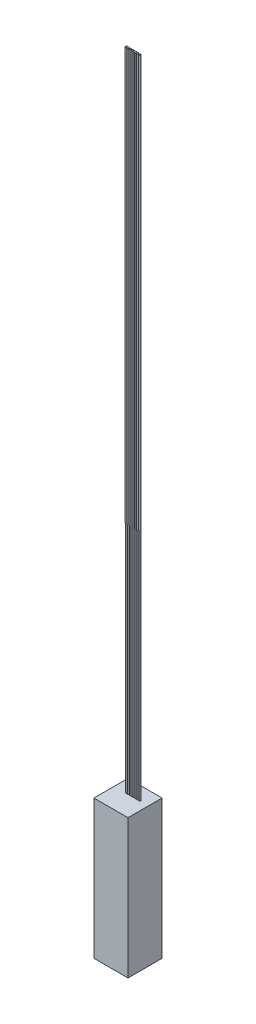
ISO-10303-21;
HEADER;
FILE_DESCRIPTION(('STEP AP214'),'2;1');
FILE_NAME('part.step','',(''),(''),'','','');
FILE_SCHEMA(('AUTOMOTIVE_DESIGN { 1 0 10303 214 1 1 1 1 }'));
ENDSEC;
DATA;
#1=APPLICATION_CONTEXT('core data for automotive mechanical design processes');
#2=APPLICATION_PROTOCOL_DEFINITION('international standard','automotive_design',2000,#1);
#3=PRODUCT_CONTEXT('',#1,'mechanical');
#4=PRODUCT('Part','Part','',(#3));
#5=PRODUCT_RELATED_PRODUCT_CATEGORY('part','',(#4));
#6=PRODUCT_DEFINITION_FORMATION('','',#4);
#7=PRODUCT_DEFINITION_CONTEXT('part definition',#1,'design');
#8=PRODUCT_DEFINITION('design','',#6,#7);
#9=PRODUCT_DEFINITION_SHAPE('','',#8);
#10=(LENGTH_UNIT() NAMED_UNIT(*) SI_UNIT(.MILLI.,.METRE.));
#11=(NAMED_UNIT(*) PLANE_ANGLE_UNIT() SI_UNIT($,.RADIAN.));
#12=(NAMED_UNIT(*) SI_UNIT($,.STERADIAN.) SOLID_ANGLE_UNIT());
#13=UNCERTAINTY_MEASURE_WITH_UNIT(LENGTH_MEASURE(1.E-05),#10,'distance_accuracy_value','');
#14=(GEOMETRIC_REPRESENTATION_CONTEXT(3) GLOBAL_UNCERTAINTY_ASSIGNED_CONTEXT((#13)) GLOBAL_UNIT_ASSIGNED_CONTEXT((#10,
#11,#12)) REPRESENTATION_CONTEXT('',''));
#15=CARTESIAN_POINT('',(0.,0.,0.));
#16=DIRECTION('',(0.,0.,1.));
#17=DIRECTION('',(1.,0.,0.));
#18=AXIS2_PLACEMENT_3D('',#15,#16,#17);
#19=CARTESIAN_POINT('',(1.13,57.1,0.968));
#20=DIRECTION('',(0.,-1.,0.));
#21=DIRECTION('',(0.,0.,-1.));
#22=AXIS2_PLACEMENT_3D('',#19,#20,#21);
#23=CYLINDRICAL_SURFACE('',#22,0.0649999999999999);
#24=CARTESIAN_POINT('',(1.13,57.1,0.968));
#25=DIRECTION('',(0.,1.,0.));
#26=DIRECTION('',(0.,0.,1.));
#27=AXIS2_PLACEMENT_3D('',#24,#25,#26);
#28=CIRCLE('',#27,0.0649999999999999);
#29=CARTESIAN_POINT('',(1.13,57.1,1.033));
#30=VERTEX_POINT('',#29);
#31=EDGE_CURVE('E11',#30,#30,#28,.T.);
#32=ORIENTED_EDGE('',*,*,#31,.F.);
#33=EDGE_LOOP('',(#32));
#34=FACE_BOUND('',#33,.T.);
#35=CARTESIAN_POINT('',(1.13,27.1,0.968));
#36=DIRECTION('',(0.,1.,0.));
#37=DIRECTION('',(0.,0.,1.));
#38=AXIS2_PLACEMENT_3D('',#35,#36,#37);
#39=CIRCLE('',#38,0.0649999999999999);
#40=CARTESIAN_POINT('',(1.13,27.1,1.033));
#41=VERTEX_POINT('',#40);
#42=EDGE_CURVE('E42',#41,#41,#39,.T.);
#43=ORIENTED_EDGE('',*,*,#42,.T.);
#44=EDGE_LOOP('',(#43));
#45=FACE_BOUND('',#44,.T.);
#46=ADVANCED_FACE('F39',(#34,#45),#23,.T.);
#47=CARTESIAN_POINT('',(1.13,57.1,0.968));
#48=DIRECTION('',(0.,1.,0.));
#49=DIRECTION('',(0.,0.,1.));
#50=AXIS2_PLACEMENT_3D('',#47,#48,#49);
#51=PLANE('',#50);
#52=ORIENTED_EDGE('',*,*,#31,.T.);
#53=EDGE_LOOP('',(#52));
#54=FACE_BOUND('',#53,.T.);
#55=ADVANCED_FACE('F54',(#54),#51,.T.);
#56=CARTESIAN_POINT('',(1.13,27.1,0.968));
#57=DIRECTION('',(0.,1.,0.));
#58=DIRECTION('',(0.,0.,1.));
#59=AXIS2_PLACEMENT_3D('',#56,#57,#58);
#60=PLANE('',#59);
#61=ORIENTED_EDGE('',*,*,#42,.F.);
#62=EDGE_LOOP('',(#61));
#63=FACE_BOUND('',#62,.T.);
#64=ADVANCED_FACE('F52',(#63),#60,.F.);
#65=CLOSED_SHELL('',(#46,#55,#64));
#66=MANIFOLD_SOLID_BREP('B2',#65);
#67=CARTESIAN_POINT('',(0.99,57.1,0.968));
#68=DIRECTION('',(0.,-1.,0.));
#69=DIRECTION('',(0.,0.,-1.));
#70=AXIS2_PLACEMENT_3D('',#67,#68,#69);
#71=CYLINDRICAL_SURFACE('',#70,0.0649999999999999);
#72=CARTESIAN_POINT('',(0.99,57.1,0.968));
#73=DIRECTION('',(0.,1.,0.));
#74=DIRECTION('',(0.,0.,1.));
#75=AXIS2_PLACEMENT_3D('',#72,#73,#74);
#76=CIRCLE('',#75,0.0649999999999999);
#77=CARTESIAN_POINT('',(0.99,57.1,1.033));
#78=VERTEX_POINT('',#77);
#79=EDGE_CURVE('E38',#78,#78,#76,.T.);
#80=ORIENTED_EDGE('',*,*,#79,.F.);
#81=EDGE_LOOP('',(#80));
#82=FACE_BOUND('',#81,.T.);
#83=CARTESIAN_POINT('',(0.99,27.1,0.968));
#84=DIRECTION('',(0.,1.,0.));
#85=DIRECTION('',(0.,0.,1.));
#86=AXIS2_PLACEMENT_3D('',#83,#84,#85);
#87=CIRCLE('',#86,0.0649999999999999);
#88=CARTESIAN_POINT('',(0.99,27.1,1.033));
#89=VERTEX_POINT('',#88);
#90=EDGE_CURVE('E90',#89,#89,#87,.T.);
#91=ORIENTED_EDGE('',*,*,#90,.T.);
#92=EDGE_LOOP('',(#91));
#93=FACE_BOUND('',#92,.T.);
#94=ADVANCED_FACE('F87',(#82,#93),#71,.T.);
#95=CARTESIAN_POINT('',(0.99,57.1,0.968));
#96=DIRECTION('',(0.,1.,0.));
#97=DIRECTION('',(0.,0.,1.));
#98=AXIS2_PLACEMENT_3D('',#95,#96,#97);
#99=PLANE('',#98);
#100=ORIENTED_EDGE('',*,*,#79,.T.);
#101=EDGE_LOOP('',(#100));
#102=FACE_BOUND('',#101,.T.);
#103=ADVANCED_FACE('F102',(#102),#99,.T.);
#104=CARTESIAN_POINT('',(0.99,27.1,0.968));
#105=DIRECTION('',(0.,1.,0.));
#106=DIRECTION('',(0.,0.,1.));
#107=AXIS2_PLACEMENT_3D('',#104,#105,#106);
#108=PLANE('',#107);
#109=ORIENTED_EDGE('',*,*,#90,.F.);
#110=EDGE_LOOP('',(#109));
#111=FACE_BOUND('',#110,.T.);
#112=ADVANCED_FACE('F100',(#111),#108,.F.);
#113=CLOSED_SHELL('',(#94,#103,#112));
#114=MANIFOLD_SOLID_BREP('B6',#113);
#115=CARTESIAN_POINT('',(0.85,57.1,0.968));
#116=DIRECTION('',(0.,-1.,0.));
#117=DIRECTION('',(0.,0.,-1.));
#118=AXIS2_PLACEMENT_3D('',#115,#116,#117);
#119=CYLINDRICAL_SURFACE('',#118,0.065);
#120=CARTESIAN_POINT('',(0.85,57.1,0.968));
#121=DIRECTION('',(0.,1.,0.));
#122=DIRECTION('',(0.,0.,1.));
#123=AXIS2_PLACEMENT_3D('',#120,#121,#122);
#124=CIRCLE('',#123,0.065);
#125=CARTESIAN_POINT('',(0.85,57.1,1.033));
#126=VERTEX_POINT('',#125);
#127=EDGE_CURVE('E86',#126,#126,#124,.T.);
#128=ORIENTED_EDGE('',*,*,#127,.F.);
#129=EDGE_LOOP('',(#128));
#130=FACE_BOUND('',#129,.T.);
#131=CARTESIAN_POINT('',(0.85,27.1,0.968));
#132=DIRECTION('',(0.,1.,0.));
#133=DIRECTION('',(0.,0.,1.));
#134=AXIS2_PLACEMENT_3D('',#131,#132,#133);
#135=CIRCLE('',#134,0.065);
#136=CARTESIAN_POINT('',(0.85,27.1,1.033));
#137=VERTEX_POINT('',#136);
#138=EDGE_CURVE('E138',#137,#137,#135,.T.);
#139=ORIENTED_EDGE('',*,*,#138,.T.);
#140=EDGE_LOOP('',(#139));
#141=FACE_BOUND('',#140,.T.);
#142=ADVANCED_FACE('F135',(#130,#141),#119,.T.);
#143=CARTESIAN_POINT('',(0.85,57.1,0.968));
#144=DIRECTION('',(0.,1.,0.));
#145=DIRECTION('',(0.,0.,1.));
#146=AXIS2_PLACEMENT_3D('',#143,#144,#145);
#147=PLANE('',#146);
#148=ORIENTED_EDGE('',*,*,#127,.T.);
#149=EDGE_LOOP('',(#148));
#150=FACE_BOUND('',#149,.T.);
#151=ADVANCED_FACE('F150',(#150),#147,.T.);
#152=CARTESIAN_POINT('',(0.85,27.1,0.968));
#153=DIRECTION('',(0.,1.,0.));
#154=DIRECTION('',(0.,0.,1.));
#155=AXIS2_PLACEMENT_3D('',#152,#153,#154);
#156=PLANE('',#155);
#157=ORIENTED_EDGE('',*,*,#138,.F.);
#158=EDGE_LOOP('',(#157));
#159=FACE_BOUND('',#158,.T.);
#160=ADVANCED_FACE('F148',(#159),#156,.F.);
#161=CLOSED_SHELL('',(#142,#151,#160));
#162=MANIFOLD_SOLID_BREP('B33',#161);
#163=CARTESIAN_POINT('',(1.27,57.1,0.968));
#164=DIRECTION('',(0.,-1.,0.));
#165=DIRECTION('',(0.,0.,-1.));
#166=AXIS2_PLACEMENT_3D('',#163,#164,#165);
#167=CYLINDRICAL_SURFACE('',#166,0.0650000000000001);
#168=CARTESIAN_POINT('',(1.27,57.1,0.968));
#169=DIRECTION('',(0.,1.,0.));
#170=DIRECTION('',(0.,0.,1.));
#171=AXIS2_PLACEMENT_3D('',#168,#169,#170);
#172=CIRCLE('',#171,0.0650000000000001);
#173=CARTESIAN_POINT('',(1.27,57.1,1.033));
#174=VERTEX_POINT('',#173);
#175=EDGE_CURVE('E134',#174,#174,#172,.T.);
#176=ORIENTED_EDGE('',*,*,#175,.F.);
#177=EDGE_LOOP('',(#176));
#178=FACE_BOUND('',#177,.T.);
#179=CARTESIAN_POINT('',(1.27,27.1,0.968));
#180=DIRECTION('',(0.,1.,0.));
#181=DIRECTION('',(0.,0.,1.));
#182=AXIS2_PLACEMENT_3D('',#179,#180,#181);
#183=CIRCLE('',#182,0.0650000000000001);
#184=CARTESIAN_POINT('',(1.27,27.1,1.033));
#185=VERTEX_POINT('',#184);
#186=EDGE_CURVE('E186',#185,#185,#183,.T.);
#187=ORIENTED_EDGE('',*,*,#186,.T.);
#188=EDGE_LOOP('',(#187));
#189=FACE_BOUND('',#188,.T.);
#190=ADVANCED_FACE('F183',(#178,#189),#167,.T.);
#191=CARTESIAN_POINT('',(1.27,57.1,0.968));
#192=DIRECTION('',(0.,1.,0.));
#193=DIRECTION('',(0.,0.,1.));
#194=AXIS2_PLACEMENT_3D('',#191,#192,#193);
#195=PLANE('',#194);
#196=ORIENTED_EDGE('',*,*,#175,.T.);
#197=EDGE_LOOP('',(#196));
#198=FACE_BOUND('',#197,.T.);
#199=ADVANCED_FACE('F198',(#198),#195,.T.);
#200=CARTESIAN_POINT('',(1.27,27.1,0.968));
#201=DIRECTION('',(0.,1.,0.));
#202=DIRECTION('',(0.,0.,1.));
#203=AXIS2_PLACEMENT_3D('',#200,#201,#202);
#204=PLANE('',#203);
#205=ORIENTED_EDGE('',*,*,#186,.F.);
#206=EDGE_LOOP('',(#205));
#207=FACE_BOUND('',#206,.T.);
#208=ADVANCED_FACE('F196',(#207),#204,.F.);
#209=CLOSED_SHELL('',(#190,#199,#208));
#210=MANIFOLD_SOLID_BREP('B81',#209);
#211=CARTESIAN_POINT('',(1.41,57.1,0.968));
#212=DIRECTION('',(0.,-1.,0.));
#213=DIRECTION('',(0.,0.,-1.));
#214=AXIS2_PLACEMENT_3D('',#211,#212,#213);
#215=CYLINDRICAL_SURFACE('',#214,0.0650000000000001);
#216=CARTESIAN_POINT('',(1.41,57.1,0.968));
#217=DIRECTION('',(0.,1.,0.));
#218=DIRECTION('',(0.,0.,1.));
#219=AXIS2_PLACEMENT_3D('',#216,#217,#218);
#220=CIRCLE('',#219,0.0650000000000001);
#221=CARTESIAN_POINT('',(1.41,57.1,1.033));
#222=VERTEX_POINT('',#221);
#223=EDGE_CURVE('E182',#222,#222,#220,.T.);
#224=ORIENTED_EDGE('',*,*,#223,.F.);
#225=EDGE_LOOP('',(#224));
#226=FACE_BOUND('',#225,.T.);
#227=CARTESIAN_POINT('',(1.41,27.1,0.968));
#228=DIRECTION('',(0.,1.,0.));
#229=DIRECTION('',(0.,0.,1.));
#230=AXIS2_PLACEMENT_3D('',#227,#228,#229);
#231=CIRCLE('',#230,0.0650000000000001);
#232=CARTESIAN_POINT('',(1.41,27.1,1.033));
#233=VERTEX_POINT('',#232);
#234=EDGE_CURVE('E234',#233,#233,#231,.T.);
#235=ORIENTED_EDGE('',*,*,#234,.T.);
#236=EDGE_LOOP('',(#235));
#237=FACE_BOUND('',#236,.T.);
#238=ADVANCED_FACE('F231',(#226,#237),#215,.T.);
#239=CARTESIAN_POINT('',(1.41,57.1,0.968));
#240=DIRECTION('',(0.,1.,0.));
#241=DIRECTION('',(0.,0.,1.));
#242=AXIS2_PLACEMENT_3D('',#239,#240,#241);
#243=PLANE('',#242);
#244=ORIENTED_EDGE('',*,*,#223,.T.);
#245=EDGE_LOOP('',(#244));
#246=FACE_BOUND('',#245,.T.);
#247=ADVANCED_FACE('F246',(#246),#243,.T.);
#248=CARTESIAN_POINT('',(1.41,27.1,0.968));
#249=DIRECTION('',(0.,1.,0.));
#250=DIRECTION('',(0.,0.,1.));
#251=AXIS2_PLACEMENT_3D('',#248,#249,#250);
#252=PLANE('',#251);
#253=ORIENTED_EDGE('',*,*,#234,.F.);
#254=EDGE_LOOP('',(#253));
#255=FACE_BOUND('',#254,.T.);
#256=ADVANCED_FACE('F244',(#255),#252,.F.);
#257=CLOSED_SHELL('',(#238,#247,#256));
#258=MANIFOLD_SOLID_BREP('B129',#257);
#259=CARTESIAN_POINT('',(1.55,57.1,0.968));
#260=DIRECTION('',(0.,-1.,0.));
#261=DIRECTION('',(0.,0.,-1.));
#262=AXIS2_PLACEMENT_3D('',#259,#260,#261);
#263=CYLINDRICAL_SURFACE('',#262,0.0649999999999999);
#264=CARTESIAN_POINT('',(1.55,57.1,0.968));
#265=DIRECTION('',(0.,1.,0.));
#266=DIRECTION('',(0.,0.,1.));
#267=AXIS2_PLACEMENT_3D('',#264,#265,#266);
#268=CIRCLE('',#267,0.0649999999999999);
#269=CARTESIAN_POINT('',(1.55,57.1,1.033));
#270=VERTEX_POINT('',#269);
#271=EDGE_CURVE('E230',#270,#270,#268,.T.);
#272=ORIENTED_EDGE('',*,*,#271,.F.);
#273=EDGE_LOOP('',(#272));
#274=FACE_BOUND('',#273,.T.);
#275=CARTESIAN_POINT('',(1.55,27.1,0.968));
#276=DIRECTION('',(0.,1.,0.));
#277=DIRECTION('',(0.,0.,1.));
#278=AXIS2_PLACEMENT_3D('',#275,#276,#277);
#279=CIRCLE('',#278,0.0649999999999999);
#280=CARTESIAN_POINT('',(1.55,27.1,1.033));
#281=VERTEX_POINT('',#280);
#282=EDGE_CURVE('E282',#281,#281,#279,.T.);
#283=ORIENTED_EDGE('',*,*,#282,.T.);
#284=EDGE_LOOP('',(#283));
#285=FACE_BOUND('',#284,.T.);
#286=ADVANCED_FACE('F279',(#274,#285),#263,.T.);
#287=CARTESIAN_POINT('',(1.55,57.1,0.968));
#288=DIRECTION('',(0.,1.,0.));
#289=DIRECTION('',(0.,0.,1.));
#290=AXIS2_PLACEMENT_3D('',#287,#288,#289);
#291=PLANE('',#290);
#292=ORIENTED_EDGE('',*,*,#271,.T.);
#293=EDGE_LOOP('',(#292));
#294=FACE_BOUND('',#293,.T.);
#295=ADVANCED_FACE('F294',(#294),#291,.T.);
#296=CARTESIAN_POINT('',(1.55,27.1,0.968));
#297=DIRECTION('',(0.,1.,0.));
#298=DIRECTION('',(0.,0.,1.));
#299=AXIS2_PLACEMENT_3D('',#296,#297,#298);
#300=PLANE('',#299);
#301=ORIENTED_EDGE('',*,*,#282,.F.);
#302=EDGE_LOOP('',(#301));
#303=FACE_BOUND('',#302,.T.);
#304=ADVANCED_FACE('F292',(#303),#300,.F.);
#305=CLOSED_SHELL('',(#286,#295,#304));
#306=MANIFOLD_SOLID_BREP('B177',#305);
#307=CARTESIAN_POINT('',(1.69,57.1,0.968));
#308=DIRECTION('',(0.,-1.,0.));
#309=DIRECTION('',(0.,0.,-1.));
#310=AXIS2_PLACEMENT_3D('',#307,#308,#309);
#311=CYLINDRICAL_SURFACE('',#310,0.0649999999999999);
#312=CARTESIAN_POINT('',(1.69,57.1,0.968));
#313=DIRECTION('',(0.,1.,0.));
#314=DIRECTION('',(0.,0.,1.));
#315=AXIS2_PLACEMENT_3D('',#312,#313,#314);
#316=CIRCLE('',#315,0.0649999999999999);
#317=CARTESIAN_POINT('',(1.69,57.1,1.033));
#318=VERTEX_POINT('',#317);
#319=EDGE_CURVE('E278',#318,#318,#316,.T.);
#320=ORIENTED_EDGE('',*,*,#319,.F.);
#321=EDGE_LOOP('',(#320));
#322=FACE_BOUND('',#321,.T.);
#323=CARTESIAN_POINT('',(1.69,27.1,0.968));
#324=DIRECTION('',(0.,1.,0.));
#325=DIRECTION('',(0.,0.,1.));
#326=AXIS2_PLACEMENT_3D('',#323,#324,#325);
#327=CIRCLE('',#326,0.0649999999999999);
#328=CARTESIAN_POINT('',(1.69,27.1,1.033));
#329=VERTEX_POINT('',#328);
#330=EDGE_CURVE('E330',#329,#329,#327,.T.);
#331=ORIENTED_EDGE('',*,*,#330,.T.);
#332=EDGE_LOOP('',(#331));
#333=FACE_BOUND('',#332,.T.);
#334=ADVANCED_FACE('F327',(#322,#333),#311,.T.);
#335=CARTESIAN_POINT('',(1.69,57.1,0.968));
#336=DIRECTION('',(0.,1.,0.));
#337=DIRECTION('',(0.,0.,1.));
#338=AXIS2_PLACEMENT_3D('',#335,#336,#337);
#339=PLANE('',#338);
#340=ORIENTED_EDGE('',*,*,#319,.T.);
#341=EDGE_LOOP('',(#340));
#342=FACE_BOUND('',#341,.T.);
#343=ADVANCED_FACE('F342',(#342),#339,.T.);
#344=CARTESIAN_POINT('',(1.69,27.1,0.968));
#345=DIRECTION('',(0.,1.,0.));
#346=DIRECTION('',(0.,0.,1.));
#347=AXIS2_PLACEMENT_3D('',#344,#345,#346);
#348=PLANE('',#347);
#349=ORIENTED_EDGE('',*,*,#330,.F.);
#350=EDGE_LOOP('',(#349));
#351=FACE_BOUND('',#350,.T.);
#352=ADVANCED_FACE('F340',(#351),#348,.F.);
#353=CLOSED_SHELL('',(#334,#343,#352));
#354=MANIFOLD_SOLID_BREP('B225',#353);
#355=CARTESIAN_POINT('',(1.83,57.1,0.968));
#356=DIRECTION('',(0.,-1.,0.));
#357=DIRECTION('',(0.,0.,-1.));
#358=AXIS2_PLACEMENT_3D('',#355,#356,#357);
#359=CYLINDRICAL_SURFACE('',#358,0.0650000000000001);
#360=CARTESIAN_POINT('',(1.83,57.1,0.968));
#361=DIRECTION('',(0.,1.,0.));
#362=DIRECTION('',(0.,0.,1.));
#363=AXIS2_PLACEMENT_3D('',#360,#361,#362);
#364=CIRCLE('',#363,0.0650000000000001);
#365=CARTESIAN_POINT('',(1.83,57.1,1.033));
#366=VERTEX_POINT('',#365);
#367=EDGE_CURVE('E326',#366,#366,#364,.T.);
#368=ORIENTED_EDGE('',*,*,#367,.F.);
#369=EDGE_LOOP('',(#368));
#370=FACE_BOUND('',#369,.T.);
#371=CARTESIAN_POINT('',(1.83,27.1,0.968));
#372=DIRECTION('',(0.,1.,0.));
#373=DIRECTION('',(0.,0.,1.));
#374=AXIS2_PLACEMENT_3D('',#371,#372,#373);
#375=CIRCLE('',#374,0.0650000000000001);
#376=CARTESIAN_POINT('',(1.83,27.1,1.033));
#377=VERTEX_POINT('',#376);
#378=EDGE_CURVE('E379',#377,#377,#375,.T.);
#379=ORIENTED_EDGE('',*,*,#378,.T.);
#380=EDGE_LOOP('',(#379));
#381=FACE_BOUND('',#380,.T.);
#382=ADVANCED_FACE('F376',(#370,#381),#359,.T.);
#383=CARTESIAN_POINT('',(1.83,57.1,0.968));
#384=DIRECTION('',(0.,1.,0.));
#385=DIRECTION('',(0.,0.,1.));
#386=AXIS2_PLACEMENT_3D('',#383,#384,#385);
#387=PLANE('',#386);
#388=ORIENTED_EDGE('',*,*,#367,.T.);
#389=EDGE_LOOP('',(#388));
#390=FACE_BOUND('',#389,.T.);
#391=ADVANCED_FACE('F391',(#390),#387,.T.);
#392=CARTESIAN_POINT('',(1.83,27.1,0.968));
#393=DIRECTION('',(0.,1.,0.));
#394=DIRECTION('',(0.,0.,1.));
#395=AXIS2_PLACEMENT_3D('',#392,#393,#394);
#396=PLANE('',#395);
#397=ORIENTED_EDGE('',*,*,#378,.F.);
#398=EDGE_LOOP('',(#397));
#399=FACE_BOUND('',#398,.T.);
#400=ADVANCED_FACE('F389',(#399),#396,.F.);
#401=CLOSED_SHELL('',(#382,#391,#400));
#402=MANIFOLD_SOLID_BREP('B273',#401);
#403=CARTESIAN_POINT('',(0.,10.1,0.));
#404=DIRECTION('',(1.,0.,0.));
#405=DIRECTION('',(0.,0.,-1.));
#406=AXIS2_PLACEMENT_3D('',#403,#404,#405);
#407=PLANE('',#406);
#408=DIRECTION('',(0.,0.,1.));
#409=VECTOR('',#408,1.);
#410=CARTESIAN_POINT('',(0.,0.,0.));
#411=LINE('',#410,#409);
#412=CARTESIAN_POINT('',(0.,0.,0.));
#413=VERTEX_POINT('',#412);
#414=CARTESIAN_POINT('',(0.,0.,2.47855));
#415=VERTEX_POINT('',#414);
#416=EDGE_CURVE('E479',#413,#415,#411,.T.);
#417=ORIENTED_EDGE('',*,*,#416,.T.);
#418=DIRECTION('',(0.,-1.,0.));
#419=VECTOR('',#418,1.);
#420=CARTESIAN_POINT('',(0.,10.1,2.47855));
#421=LINE('',#420,#419);
#422=CARTESIAN_POINT('',(0.,10.1,2.47855));
#423=VERTEX_POINT('',#422);
#424=EDGE_CURVE('E374',#423,#415,#421,.T.);
#425=ORIENTED_EDGE('',*,*,#424,.F.);
#426=DIRECTION('',(0.,0.,1.));
#427=VECTOR('',#426,1.);
#428=CARTESIAN_POINT('',(0.,10.1,0.));
#429=LINE('',#428,#427);
#430=CARTESIAN_POINT('',(0.,10.1,0.));
#431=VERTEX_POINT('',#430);
#432=EDGE_CURVE('E467',#431,#423,#429,.T.);
#433=ORIENTED_EDGE('',*,*,#432,.F.);
#434=DIRECTION('',(0.,-1.,0.));
#435=VECTOR('',#434,1.);
#436=CARTESIAN_POINT('',(0.,10.1,0.));
#437=LINE('',#436,#435);
#438=EDGE_CURVE('E475',#431,#413,#437,.T.);
#439=ORIENTED_EDGE('',*,*,#438,.T.);
#440=EDGE_LOOP('',(#417,#425,#433,#439));
#441=FACE_BOUND('',#440,.T.);
#442=ADVANCED_FACE('F416',(#441),#407,.F.);
#443=CARTESIAN_POINT('',(0.,10.1,2.47855));
#444=DIRECTION('',(0.,0.,-1.));
#445=DIRECTION('',(-1.,0.,0.));
#446=AXIS2_PLACEMENT_3D('',#443,#444,#445);
#447=PLANE('',#446);
#448=DIRECTION('',(1.,0.,0.));
#449=VECTOR('',#448,1.);
#450=CARTESIAN_POINT('',(0.,0.,2.47855));
#451=LINE('',#450,#449);
#452=CARTESIAN_POINT('',(2.47855,0.,2.47855));
#453=VERTEX_POINT('',#452);
#454=EDGE_CURVE('E471',#415,#453,#451,.T.);
#455=ORIENTED_EDGE('',*,*,#454,.T.);
#456=DIRECTION('',(0.,-1.,0.));
#457=VECTOR('',#456,1.);
#458=CARTESIAN_POINT('',(2.47855,10.1,2.47855));
#459=LINE('',#458,#457);
#460=CARTESIAN_POINT('',(2.47855,10.1,2.47855));
#461=VERTEX_POINT('',#460);
#462=EDGE_CURVE('E424',#461,#453,#459,.T.);
#463=ORIENTED_EDGE('',*,*,#462,.F.);
#464=DIRECTION('',(1.,0.,0.));
#465=VECTOR('',#464,1.);
#466=CARTESIAN_POINT('',(0.,10.1,2.47855));
#467=LINE('',#466,#465);
#468=EDGE_CURVE('E462',#423,#461,#467,.T.);
#469=ORIENTED_EDGE('',*,*,#468,.F.);
#470=ORIENTED_EDGE('',*,*,#424,.T.);
#471=EDGE_LOOP('',(#455,#463,#469,#470));
#472=FACE_BOUND('',#471,.T.);
#473=ADVANCED_FACE('F470',(#472),#447,.F.);
#474=CARTESIAN_POINT('',(2.47855,10.1,0.));
#475=DIRECTION('',(-1.,0.,0.));
#476=DIRECTION('',(0.,0.,1.));
#477=AXIS2_PLACEMENT_3D('',#474,#475,#476);
#478=PLANE('',#477);
#479=DIRECTION('',(0.,0.,-1.));
#480=VECTOR('',#479,1.);
#481=CARTESIAN_POINT('',(2.47855,0.,0.));
#482=LINE('',#481,#480);
#483=CARTESIAN_POINT('',(2.47855,0.,0.));
#484=VERTEX_POINT('',#483);
#485=EDGE_CURVE('E449',#453,#484,#482,.T.);
#486=ORIENTED_EDGE('',*,*,#485,.T.);
#487=DIRECTION('',(0.,-1.,0.));
#488=VECTOR('',#487,1.);
#489=CARTESIAN_POINT('',(2.47855,10.1,0.));
#490=LINE('',#489,#488);
#491=CARTESIAN_POINT('',(2.47855,10.1,0.));
#492=VERTEX_POINT('',#491);
#493=EDGE_CURVE('E472',#492,#484,#490,.T.);
#494=ORIENTED_EDGE('',*,*,#493,.F.);
#495=DIRECTION('',(0.,0.,-1.));
#496=VECTOR('',#495,1.);
#497=CARTESIAN_POINT('',(2.47855,10.1,0.));
#498=LINE('',#497,#496);
#499=EDGE_CURVE('E465',#461,#492,#498,.T.);
#500=ORIENTED_EDGE('',*,*,#499,.F.);
#501=ORIENTED_EDGE('',*,*,#462,.T.);
#502=EDGE_LOOP('',(#486,#494,#500,#501));
#503=FACE_BOUND('',#502,.T.);
#504=ADVANCED_FACE('F473',(#503),#478,.F.);
#505=CARTESIAN_POINT('',(0.,10.1,0.));
#506=DIRECTION('',(0.,0.,1.));
#507=DIRECTION('',(1.,0.,0.));
#508=AXIS2_PLACEMENT_3D('',#505,#506,#507);
#509=PLANE('',#508);
#510=DIRECTION('',(-1.,0.,0.));
#511=VECTOR('',#510,1.);
#512=CARTESIAN_POINT('',(0.,0.,0.));
#513=LINE('',#512,#511);
#514=EDGE_CURVE('E455',#484,#413,#513,.T.);
#515=ORIENTED_EDGE('',*,*,#514,.T.);
#516=ORIENTED_EDGE('',*,*,#438,.F.);
#517=DIRECTION('',(-1.,0.,0.));
#518=VECTOR('',#517,1.);
#519=CARTESIAN_POINT('',(0.,10.1,0.));
#520=LINE('',#519,#518);
#521=EDGE_CURVE('E432',#492,#431,#520,.T.);
#522=ORIENTED_EDGE('',*,*,#521,.F.);
#523=ORIENTED_EDGE('',*,*,#493,.T.);
#524=EDGE_LOOP('',(#515,#516,#522,#523));
#525=FACE_BOUND('',#524,.T.);
#526=ADVANCED_FACE('F487',(#525),#509,.F.);
#527=CARTESIAN_POINT('',(0.,10.1,0.));
#528=DIRECTION('',(0.,1.,0.));
#529=DIRECTION('',(0.,0.,1.));
#530=AXIS2_PLACEMENT_3D('',#527,#528,#529);
#531=PLANE('',#530);
#532=CARTESIAN_POINT('',(0.99,10.1,0.968));
#533=DIRECTION('',(0.,1.,0.));
#534=DIRECTION('',(0.,0.,1.));
#535=AXIS2_PLACEMENT_3D('',#532,#533,#534);
#536=CIRCLE('',#535,0.0500000000000002);
#537=CARTESIAN_POINT('',(0.99,10.1,1.018));
#538=VERTEX_POINT('',#537);
#539=EDGE_CURVE('E532',#538,#538,#536,.T.);
#540=ORIENTED_EDGE('',*,*,#539,.F.);
#541=EDGE_LOOP('',(#540));
#542=FACE_BOUND('',#541,.T.);
#543=CARTESIAN_POINT('',(0.85,10.1,0.968));
#544=DIRECTION('',(0.,1.,0.));
#545=DIRECTION('',(0.,0.,1.));
#546=AXIS2_PLACEMENT_3D('',#543,#544,#545);
#547=CIRCLE('',#546,0.0500000000000001);
#548=CARTESIAN_POINT('',(0.85,10.1,1.018));
#549=VERTEX_POINT('',#548);
#550=EDGE_CURVE('E526',#549,#549,#547,.T.);
#551=ORIENTED_EDGE('',*,*,#550,.F.);
#552=EDGE_LOOP('',(#551));
#553=FACE_BOUND('',#552,.T.);
#554=CARTESIAN_POINT('',(1.13,10.1,0.968));
#555=DIRECTION('',(0.,1.,0.));
#556=DIRECTION('',(0.,0.,1.));
#557=AXIS2_PLACEMENT_3D('',#554,#555,#556);
#558=CIRCLE('',#557,0.0500000000000002);
#559=CARTESIAN_POINT('',(1.13,10.1,1.018));
#560=VERTEX_POINT('',#559);
#561=EDGE_CURVE('E520',#560,#560,#558,.T.);
#562=ORIENTED_EDGE('',*,*,#561,.F.);
#563=EDGE_LOOP('',(#562));
#564=FACE_BOUND('',#563,.T.);
#565=CARTESIAN_POINT('',(1.27,10.1,0.968));
#566=DIRECTION('',(0.,1.,0.));
#567=DIRECTION('',(0.,0.,1.));
#568=AXIS2_PLACEMENT_3D('',#565,#566,#567);
#569=CIRCLE('',#568,0.0499999999999999);
#570=CARTESIAN_POINT('',(1.27,10.1,1.018));
#571=VERTEX_POINT('',#570);
#572=EDGE_CURVE('E514',#571,#571,#569,.T.);
#573=ORIENTED_EDGE('',*,*,#572,.F.);
#574=EDGE_LOOP('',(#573));
#575=FACE_BOUND('',#574,.T.);
#576=CARTESIAN_POINT('',(1.41,10.1,0.968));
#577=DIRECTION('',(0.,1.,0.));
#578=DIRECTION('',(0.,0.,1.));
#579=AXIS2_PLACEMENT_3D('',#576,#577,#578);
#580=CIRCLE('',#579,0.0499999999999999);
#581=CARTESIAN_POINT('',(1.41,10.1,1.018));
#582=VERTEX_POINT('',#581);
#583=EDGE_CURVE('E508',#582,#582,#580,.T.);
#584=ORIENTED_EDGE('',*,*,#583,.F.);
#585=EDGE_LOOP('',(#584));
#586=FACE_BOUND('',#585,.T.);
#587=CARTESIAN_POINT('',(1.55,10.1,0.968));
#588=DIRECTION('',(0.,1.,0.));
#589=DIRECTION('',(0.,0.,1.));
#590=AXIS2_PLACEMENT_3D('',#587,#588,#589);
#591=CIRCLE('',#590,0.0500000000000002);
#592=CARTESIAN_POINT('',(1.55,10.1,1.018));
#593=VERTEX_POINT('',#592);
#594=EDGE_CURVE('E502',#593,#593,#591,.T.);
#595=ORIENTED_EDGE('',*,*,#594,.F.);
#596=EDGE_LOOP('',(#595));
#597=FACE_BOUND('',#596,.T.);
#598=CARTESIAN_POINT('',(1.69,10.1,0.968));
#599=DIRECTION('',(0.,1.,0.));
#600=DIRECTION('',(0.,0.,1.));
#601=AXIS2_PLACEMENT_3D('',#598,#599,#600);
#602=CIRCLE('',#601,0.0500000000000002);
#603=CARTESIAN_POINT('',(1.69,10.1,1.018));
#604=VERTEX_POINT('',#603);
#605=EDGE_CURVE('E496',#604,#604,#602,.T.);
#606=ORIENTED_EDGE('',*,*,#605,.F.);
#607=EDGE_LOOP('',(#606));
#608=FACE_BOUND('',#607,.T.);
#609=CARTESIAN_POINT('',(1.83,10.1,0.968));
#610=DIRECTION('',(0.,1.,0.));
#611=DIRECTION('',(0.,0.,1.));
#612=AXIS2_PLACEMENT_3D('',#609,#610,#611);
#613=CIRCLE('',#612,0.0500000000000002);
#614=CARTESIAN_POINT('',(1.83,10.1,1.018));
#615=VERTEX_POINT('',#614);
#616=EDGE_CURVE('E493',#615,#615,#613,.T.);
#617=ORIENTED_EDGE('',*,*,#616,.F.);
#618=EDGE_LOOP('',(#617));
#619=FACE_BOUND('',#618,.T.);
#620=ORIENTED_EDGE('',*,*,#432,.T.);
#621=ORIENTED_EDGE('',*,*,#468,.T.);
#622=ORIENTED_EDGE('',*,*,#499,.T.);
#623=ORIENTED_EDGE('',*,*,#521,.T.);
#624=EDGE_LOOP('',(#620,#621,#622,#623));
#625=FACE_BOUND('',#624,.T.);
#626=ADVANCED_FACE('F463',(#542,#553,#564,#575,#586,#597,#608,#619,#625),#531,.T.);
#627=CARTESIAN_POINT('',(0.,0.,0.));
#628=DIRECTION('',(0.,1.,0.));
#629=DIRECTION('',(0.,0.,1.));
#630=AXIS2_PLACEMENT_3D('',#627,#628,#629);
#631=PLANE('',#630);
#632=ORIENTED_EDGE('',*,*,#416,.F.);
#633=ORIENTED_EDGE('',*,*,#514,.F.);
#634=ORIENTED_EDGE('',*,*,#485,.F.);
#635=ORIENTED_EDGE('',*,*,#454,.F.);
#636=EDGE_LOOP('',(#632,#633,#634,#635));
#637=FACE_BOUND('',#636,.T.);
#638=ADVANCED_FACE('F490',(#637),#631,.F.);
#639=CARTESIAN_POINT('',(1.83,27.1,0.968));
#640=DIRECTION('',(0.,-1.,0.));
#641=DIRECTION('',(0.,0.,-1.));
#642=AXIS2_PLACEMENT_3D('',#639,#640,#641);
#643=CYLINDRICAL_SURFACE('',#642,0.0500000000000002);
#644=CARTESIAN_POINT('',(1.83,27.1,0.968));
#645=DIRECTION('',(0.,1.,0.));
#646=DIRECTION('',(0.,0.,1.));
#647=AXIS2_PLACEMENT_3D('',#644,#645,#646);
#648=CIRCLE('',#647,0.0500000000000002);
#649=CARTESIAN_POINT('',(1.83,27.1,1.018));
#650=VERTEX_POINT('',#649);
#651=EDGE_CURVE('E482',#650,#650,#648,.T.);
#652=ORIENTED_EDGE('',*,*,#651,.F.);
#653=EDGE_LOOP('',(#652));
#654=FACE_BOUND('',#653,.T.);
#655=ORIENTED_EDGE('',*,*,#616,.T.);
#656=EDGE_LOOP('',(#655));
#657=FACE_BOUND('',#656,.T.);
#658=ADVANCED_FACE('F560',(#654,#657),#643,.T.);
#659=CARTESIAN_POINT('',(1.83,27.1,0.968));
#660=DIRECTION('',(0.,1.,0.));
#661=DIRECTION('',(0.,0.,1.));
#662=AXIS2_PLACEMENT_3D('',#659,#660,#661);
#663=PLANE('',#662);
#664=ORIENTED_EDGE('',*,*,#651,.T.);
#665=EDGE_LOOP('',(#664));
#666=FACE_BOUND('',#665,.T.);
#667=ADVANCED_FACE('F562',(#666),#663,.T.);
#668=CARTESIAN_POINT('',(1.69,27.1,0.968));
#669=DIRECTION('',(0.,-1.,0.));
#670=DIRECTION('',(0.,0.,-1.));
#671=AXIS2_PLACEMENT_3D('',#668,#669,#670);
#672=CYLINDRICAL_SURFACE('',#671,0.0500000000000002);
#673=CARTESIAN_POINT('',(1.69,27.1,0.968));
#674=DIRECTION('',(0.,1.,0.));
#675=DIRECTION('',(0.,0.,1.));
#676=AXIS2_PLACEMENT_3D('',#673,#674,#675);
#677=CIRCLE('',#676,0.0500000000000002);
#678=CARTESIAN_POINT('',(1.69,27.1,1.018));
#679=VERTEX_POINT('',#678);
#680=EDGE_CURVE('E499',#679,#679,#677,.T.);
#681=ORIENTED_EDGE('',*,*,#680,.F.);
#682=EDGE_LOOP('',(#681));
#683=FACE_BOUND('',#682,.T.);
#684=ORIENTED_EDGE('',*,*,#605,.T.);
#685=EDGE_LOOP('',(#684));
#686=FACE_BOUND('',#685,.T.);
#687=ADVANCED_FACE('F569',(#683,#686),#672,.T.);
#688=CARTESIAN_POINT('',(1.69,27.1,0.968));
#689=DIRECTION('',(0.,1.,0.));
#690=DIRECTION('',(0.,0.,1.));
#691=AXIS2_PLACEMENT_3D('',#688,#689,#690);
#692=PLANE('',#691);
#693=ORIENTED_EDGE('',*,*,#680,.T.);
#694=EDGE_LOOP('',(#693));
#695=FACE_BOUND('',#694,.T.);
#696=ADVANCED_FACE('F617',(#695),#692,.T.);
#697=CARTESIAN_POINT('',(1.55,27.1,0.968));
#698=DIRECTION('',(0.,-1.,0.));
#699=DIRECTION('',(0.,0.,-1.));
#700=AXIS2_PLACEMENT_3D('',#697,#698,#699);
#701=CYLINDRICAL_SURFACE('',#700,0.0500000000000002);
#702=CARTESIAN_POINT('',(1.55,27.1,0.968));
#703=DIRECTION('',(0.,1.,0.));
#704=DIRECTION('',(0.,0.,1.));
#705=AXIS2_PLACEMENT_3D('',#702,#703,#704);
#706=CIRCLE('',#705,0.0500000000000002);
#707=CARTESIAN_POINT('',(1.55,27.1,1.018));
#708=VERTEX_POINT('',#707);
#709=EDGE_CURVE('E505',#708,#708,#706,.T.);
#710=ORIENTED_EDGE('',*,*,#709,.F.);
#711=EDGE_LOOP('',(#710));
#712=FACE_BOUND('',#711,.T.);
#713=ORIENTED_EDGE('',*,*,#594,.T.);
#714=EDGE_LOOP('',(#713));
#715=FACE_BOUND('',#714,.T.);
#716=ADVANCED_FACE('F626',(#712,#715),#701,.T.);
#717=CARTESIAN_POINT('',(1.55,27.1,0.968));
#718=DIRECTION('',(0.,1.,0.));
#719=DIRECTION('',(0.,0.,1.));
#720=AXIS2_PLACEMENT_3D('',#717,#718,#719);
#721=PLANE('',#720);
#722=ORIENTED_EDGE('',*,*,#709,.T.);
#723=EDGE_LOOP('',(#722));
#724=FACE_BOUND('',#723,.T.);
#725=ADVANCED_FACE('F635',(#724),#721,.T.);
#726=CARTESIAN_POINT('',(1.41,27.1,0.968));
#727=DIRECTION('',(0.,-1.,0.));
#728=DIRECTION('',(0.,0.,-1.));
#729=AXIS2_PLACEMENT_3D('',#726,#727,#728);
#730=CYLINDRICAL_SURFACE('',#729,0.0499999999999999);
#731=CARTESIAN_POINT('',(1.41,27.1,0.968));
#732=DIRECTION('',(0.,1.,0.));
#733=DIRECTION('',(0.,0.,1.));
#734=AXIS2_PLACEMENT_3D('',#731,#732,#733);
#735=CIRCLE('',#734,0.0499999999999999);
#736=CARTESIAN_POINT('',(1.41,27.1,1.018));
#737=VERTEX_POINT('',#736);
#738=EDGE_CURVE('E511',#737,#737,#735,.T.);
#739=ORIENTED_EDGE('',*,*,#738,.F.);
#740=EDGE_LOOP('',(#739));
#741=FACE_BOUND('',#740,.T.);
#742=ORIENTED_EDGE('',*,*,#583,.T.);
#743=EDGE_LOOP('',(#742));
#744=FACE_BOUND('',#743,.T.);
#745=ADVANCED_FACE('F644',(#741,#744),#730,.T.);
#746=CARTESIAN_POINT('',(1.41,27.1,0.968));
#747=DIRECTION('',(0.,1.,0.));
#748=DIRECTION('',(0.,0.,1.));
#749=AXIS2_PLACEMENT_3D('',#746,#747,#748);
#750=PLANE('',#749);
#751=ORIENTED_EDGE('',*,*,#738,.T.);
#752=EDGE_LOOP('',(#751));
#753=FACE_BOUND('',#752,.T.);
#754=ADVANCED_FACE('F653',(#753),#750,.T.);
#755=CARTESIAN_POINT('',(1.27,27.1,0.968));
#756=DIRECTION('',(0.,-1.,0.));
#757=DIRECTION('',(0.,0.,-1.));
#758=AXIS2_PLACEMENT_3D('',#755,#756,#757);
#759=CYLINDRICAL_SURFACE('',#758,0.0499999999999999);
#760=CARTESIAN_POINT('',(1.27,27.1,0.968));
#761=DIRECTION('',(0.,1.,0.));
#762=DIRECTION('',(0.,0.,1.));
#763=AXIS2_PLACEMENT_3D('',#760,#761,#762);
#764=CIRCLE('',#763,0.0499999999999999);
#765=CARTESIAN_POINT('',(1.27,27.1,1.018));
#766=VERTEX_POINT('',#765);
#767=EDGE_CURVE('E517',#766,#766,#764,.T.);
#768=ORIENTED_EDGE('',*,*,#767,.F.);
#769=EDGE_LOOP('',(#768));
#770=FACE_BOUND('',#769,.T.);
#771=ORIENTED_EDGE('',*,*,#572,.T.);
#772=EDGE_LOOP('',(#771));
#773=FACE_BOUND('',#772,.T.);
#774=ADVANCED_FACE('F662',(#770,#773),#759,.T.);
#775=CARTESIAN_POINT('',(1.27,27.1,0.968));
#776=DIRECTION('',(0.,1.,0.));
#777=DIRECTION('',(0.,0.,1.));
#778=AXIS2_PLACEMENT_3D('',#775,#776,#777);
#779=PLANE('',#778);
#780=ORIENTED_EDGE('',*,*,#767,.T.);
#781=EDGE_LOOP('',(#780));
#782=FACE_BOUND('',#781,.T.);
#783=ADVANCED_FACE('F671',(#782),#779,.T.);
#784=CARTESIAN_POINT('',(1.13,27.1,0.968));
#785=DIRECTION('',(0.,-1.,0.));
#786=DIRECTION('',(0.,0.,-1.));
#787=AXIS2_PLACEMENT_3D('',#784,#785,#786);
#788=CYLINDRICAL_SURFACE('',#787,0.0500000000000002);
#789=CARTESIAN_POINT('',(1.13,27.1,0.968));
#790=DIRECTION('',(0.,1.,0.));
#791=DIRECTION('',(0.,0.,1.));
#792=AXIS2_PLACEMENT_3D('',#789,#790,#791);
#793=CIRCLE('',#792,0.0500000000000002);
#794=CARTESIAN_POINT('',(1.13,27.1,1.018));
#795=VERTEX_POINT('',#794);
#796=EDGE_CURVE('E523',#795,#795,#793,.T.);
#797=ORIENTED_EDGE('',*,*,#796,.F.);
#798=EDGE_LOOP('',(#797));
#799=FACE_BOUND('',#798,.T.);
#800=ORIENTED_EDGE('',*,*,#561,.T.);
#801=EDGE_LOOP('',(#800));
#802=FACE_BOUND('',#801,.T.);
#803=ADVANCED_FACE('F680',(#799,#802),#788,.T.);
#804=CARTESIAN_POINT('',(1.13,27.1,0.968));
#805=DIRECTION('',(0.,1.,0.));
#806=DIRECTION('',(0.,0.,1.));
#807=AXIS2_PLACEMENT_3D('',#804,#805,#806);
#808=PLANE('',#807);
#809=ORIENTED_EDGE('',*,*,#796,.T.);
#810=EDGE_LOOP('',(#809));
#811=FACE_BOUND('',#810,.T.);
#812=ADVANCED_FACE('F689',(#811),#808,.T.);
#813=CARTESIAN_POINT('',(0.85,27.1,0.968));
#814=DIRECTION('',(0.,-1.,0.));
#815=DIRECTION('',(0.,0.,-1.));
#816=AXIS2_PLACEMENT_3D('',#813,#814,#815);
#817=CYLINDRICAL_SURFACE('',#816,0.0500000000000001);
#818=CARTESIAN_POINT('',(0.85,27.1,0.968));
#819=DIRECTION('',(0.,1.,0.));
#820=DIRECTION('',(0.,0.,1.));
#821=AXIS2_PLACEMENT_3D('',#818,#819,#820);
#822=CIRCLE('',#821,0.0500000000000001);
#823=CARTESIAN_POINT('',(0.85,27.1,1.018));
#824=VERTEX_POINT('',#823);
#825=EDGE_CURVE('E529',#824,#824,#822,.T.);
#826=ORIENTED_EDGE('',*,*,#825,.F.);
#827=EDGE_LOOP('',(#826));
#828=FACE_BOUND('',#827,.T.);
#829=ORIENTED_EDGE('',*,*,#550,.T.);
#830=EDGE_LOOP('',(#829));
#831=FACE_BOUND('',#830,.T.);
#832=ADVANCED_FACE('F698',(#828,#831),#817,.T.);
#833=CARTESIAN_POINT('',(0.85,27.1,0.968));
#834=DIRECTION('',(0.,1.,0.));
#835=DIRECTION('',(0.,0.,1.));
#836=AXIS2_PLACEMENT_3D('',#833,#834,#835);
#837=PLANE('',#836);
#838=ORIENTED_EDGE('',*,*,#825,.T.);
#839=EDGE_LOOP('',(#838));
#840=FACE_BOUND('',#839,.T.);
#841=ADVANCED_FACE('F707',(#840),#837,.T.);
#842=CARTESIAN_POINT('',(0.99,27.1,0.968));
#843=DIRECTION('',(0.,-1.,0.));
#844=DIRECTION('',(0.,0.,-1.));
#845=AXIS2_PLACEMENT_3D('',#842,#843,#844);
#846=CYLINDRICAL_SURFACE('',#845,0.0500000000000002);
#847=CARTESIAN_POINT('',(0.99,27.1,0.968));
#848=DIRECTION('',(0.,1.,0.));
#849=DIRECTION('',(0.,0.,1.));
#850=AXIS2_PLACEMENT_3D('',#847,#848,#849);
#851=CIRCLE('',#850,0.0500000000000002);
#852=CARTESIAN_POINT('',(0.99,27.1,1.018));
#853=VERTEX_POINT('',#852);
#854=EDGE_CURVE('E535',#853,#853,#851,.T.);
#855=ORIENTED_EDGE('',*,*,#854,.F.);
#856=EDGE_LOOP('',(#855));
#857=FACE_BOUND('',#856,.T.);
#858=ORIENTED_EDGE('',*,*,#539,.T.);
#859=EDGE_LOOP('',(#858));
#860=FACE_BOUND('',#859,.T.);
#861=ADVANCED_FACE('F541',(#857,#860),#846,.T.);
#862=CARTESIAN_POINT('',(0.99,27.1,0.968));
#863=DIRECTION('',(0.,1.,0.));
#864=DIRECTION('',(0.,0.,1.));
#865=AXIS2_PLACEMENT_3D('',#862,#863,#864);
#866=PLANE('',#865);
#867=ORIENTED_EDGE('',*,*,#854,.T.);
#868=EDGE_LOOP('',(#867));
#869=FACE_BOUND('',#868,.T.);
#870=ADVANCED_FACE('F724',(#869),#866,.T.);
#871=CLOSED_SHELL('',(#442,#473,#504,#526,#626,#638,#658,#667,#687,#696,#716,#725,#745,#754,
#774,#783,#803,#812,#832,#841,#861,#870));
#872=MANIFOLD_SOLID_BREP('B321',#871);
#873=ADVANCED_BREP_SHAPE_REPRESENTATION('',(#18,#66,#114,#162,#210,#258,#306,#354,#402,#872),#14);
#874=SHAPE_DEFINITION_REPRESENTATION(#9,#873);
ENDSEC;
END-ISO-10303-21;
